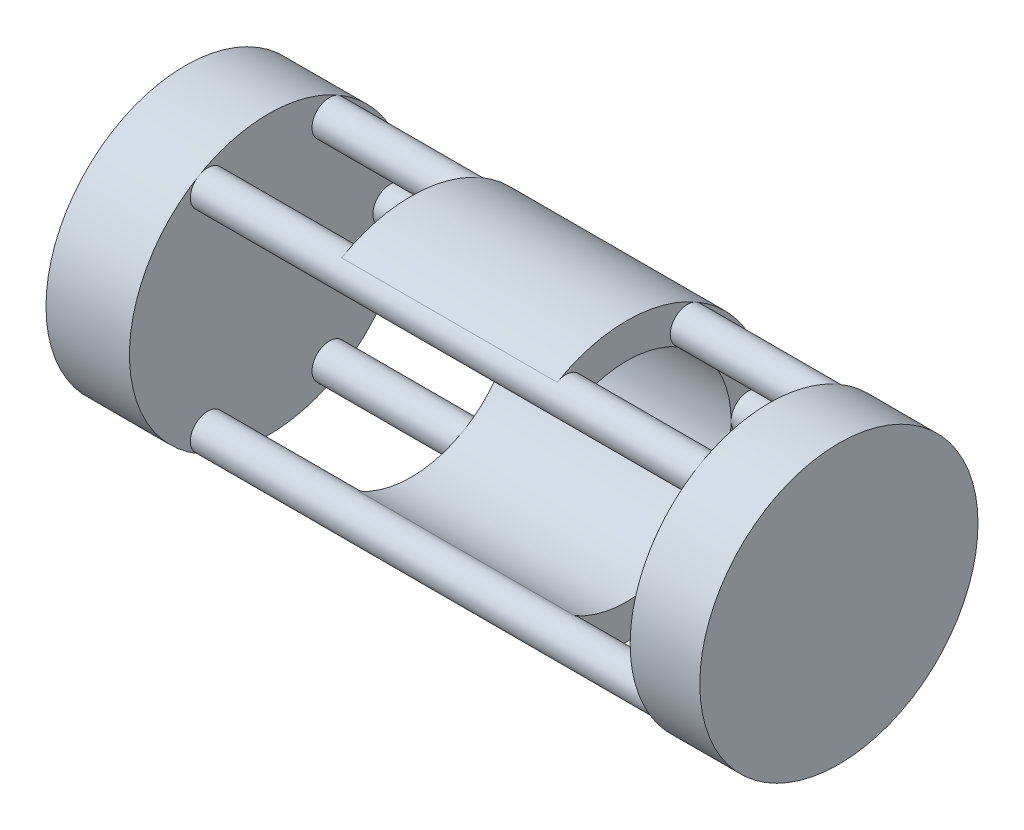
ISO-10303-21;
HEADER;
FILE_DESCRIPTION(('STEP AP214'),'2;1');
FILE_NAME('part.step','',(''),(''),'','','');
FILE_SCHEMA(('AUTOMOTIVE_DESIGN { 1 0 10303 214 1 1 1 1 }'));
ENDSEC;
DATA;
#1=APPLICATION_CONTEXT('core data for automotive mechanical design processes');
#2=APPLICATION_PROTOCOL_DEFINITION('international standard','automotive_design',2000,#1);
#3=PRODUCT_CONTEXT('',#1,'mechanical');
#4=PRODUCT('Part','Part','',(#3));
#5=PRODUCT_RELATED_PRODUCT_CATEGORY('part','',(#4));
#6=PRODUCT_DEFINITION_FORMATION('','',#4);
#7=PRODUCT_DEFINITION_CONTEXT('part definition',#1,'design');
#8=PRODUCT_DEFINITION('design','',#6,#7);
#9=PRODUCT_DEFINITION_SHAPE('','',#8);
#10=(LENGTH_UNIT() NAMED_UNIT(*) SI_UNIT(.MILLI.,.METRE.));
#11=(NAMED_UNIT(*) PLANE_ANGLE_UNIT() SI_UNIT($,.RADIAN.));
#12=(NAMED_UNIT(*) SI_UNIT($,.STERADIAN.) SOLID_ANGLE_UNIT());
#13=UNCERTAINTY_MEASURE_WITH_UNIT(LENGTH_MEASURE(1.E-05),#10,'distance_accuracy_value','');
#14=(GEOMETRIC_REPRESENTATION_CONTEXT(3) GLOBAL_UNCERTAINTY_ASSIGNED_CONTEXT((#13)) GLOBAL_UNIT_ASSIGNED_CONTEXT((#10,
#11,#12)) REPRESENTATION_CONTEXT('',''));
#15=CARTESIAN_POINT('',(0.,0.,0.));
#16=DIRECTION('',(0.,0.,1.));
#17=DIRECTION('',(1.,0.,0.));
#18=AXIS2_PLACEMENT_3D('',#15,#16,#17);
#19=CARTESIAN_POINT('',(-30.75,0.,0.));
#20=DIRECTION('',(-1.,0.,0.));
#21=DIRECTION('',(0.,0.,1.));
#22=AXIS2_PLACEMENT_3D('',#19,#20,#21);
#23=PLANE('',#22);
#24=CARTESIAN_POINT('',(-30.75,0.,0.));
#25=DIRECTION('',(-1.,0.,0.));
#26=DIRECTION('',(0.,0.,1.));
#27=AXIS2_PLACEMENT_3D('',#24,#25,#26);
#28=CIRCLE('',#27,10.);
#29=CARTESIAN_POINT('',(-30.75,0.,-10.));
#30=VERTEX_POINT('',#29);
#31=CARTESIAN_POINT('',(-30.75,-8.66025403784433,-5.0000000000001));
#32=VERTEX_POINT('',#31);
#33=EDGE_CURVE('E198',#30,#32,#28,.T.);
#34=ORIENTED_EDGE('',*,*,#33,.T.);
#35=CARTESIAN_POINT('',(-30.75,-7.57772228311379,-4.37500000000009));
#36=DIRECTION('',(-1.,0.,0.));
#37=DIRECTION('',(0.,0.866025403784433,0.50000000000001));
#38=AXIS2_PLACEMENT_3D('',#35,#36,#37);
#39=CIRCLE('',#38,1.25);
#40=CARTESIAN_POINT('',(-30.75,-6.49519052838325,-3.75000000000008));
#41=VERTEX_POINT('',#40);
#42=EDGE_CURVE('E46',#41,#32,#39,.T.);
#43=ORIENTED_EDGE('',*,*,#42,.F.);
#44=CARTESIAN_POINT('',(-30.75,0.,0.));
#45=DIRECTION('',(1.,0.,0.));
#46=DIRECTION('',(0.,0.,1.));
#47=AXIS2_PLACEMENT_3D('',#44,#45,#46);
#48=CIRCLE('',#47,7.5);
#49=CARTESIAN_POINT('',(-30.75,0.,-7.5));
#50=VERTEX_POINT('',#49);
#51=EDGE_CURVE('E200',#41,#50,#48,.T.);
#52=ORIENTED_EDGE('',*,*,#51,.T.);
#53=CARTESIAN_POINT('',(-30.75,0.,-8.75));
#54=DIRECTION('',(-1.,0.,0.));
#55=DIRECTION('',(0.,0.,1.));
#56=AXIS2_PLACEMENT_3D('',#53,#54,#55);
#57=CIRCLE('',#56,1.25);
#58=EDGE_CURVE('E40',#30,#50,#57,.T.);
#59=ORIENTED_EDGE('',*,*,#58,.F.);
#60=EDGE_LOOP('',(#34,#43,#52,#59));
#61=FACE_BOUND('',#60,.T.);
#62=ADVANCED_FACE('F32',(#61),#23,.T.);
#63=CARTESIAN_POINT('',(-30.75,6.4951905283833,-3.74999999999998));
#64=VERTEX_POINT('',#63);
#65=EDGE_CURVE('E201',#50,#64,#48,.T.);
#66=ORIENTED_EDGE('',*,*,#65,.T.);
#67=CARTESIAN_POINT('',(-30.75,7.57772228311385,-4.37499999999998));
#68=DIRECTION('',(-1.,0.,0.));
#69=DIRECTION('',(0.,-0.86602540378444,0.499999999999998));
#70=AXIS2_PLACEMENT_3D('',#67,#68,#69);
#71=CIRCLE('',#70,1.25);
#72=CARTESIAN_POINT('',(-30.75,8.6602540378444,-4.99999999999998));
#73=VERTEX_POINT('',#72);
#74=EDGE_CURVE('E52',#73,#64,#71,.T.);
#75=ORIENTED_EDGE('',*,*,#74,.F.);
#76=EDGE_CURVE('E196',#73,#30,#28,.T.);
#77=ORIENTED_EDGE('',*,*,#76,.T.);
#78=EDGE_CURVE('E183',#50,#30,#57,.T.);
#79=ORIENTED_EDGE('',*,*,#78,.F.);
#80=EDGE_LOOP('',(#66,#75,#77,#79));
#81=FACE_BOUND('',#80,.T.);
#82=ADVANCED_FACE('F231',(#81),#23,.T.);
#83=CARTESIAN_POINT('',(-30.75,6.49519052838327,3.75000000000003));
#84=VERTEX_POINT('',#83);
#85=EDGE_CURVE('E195',#64,#84,#48,.T.);
#86=ORIENTED_EDGE('',*,*,#85,.T.);
#87=CARTESIAN_POINT('',(-30.75,7.57772228311382,4.37500000000004));
#88=DIRECTION('',(-1.,0.,0.));
#89=DIRECTION('',(0.,-0.866025403784436,-0.500000000000004));
#90=AXIS2_PLACEMENT_3D('',#87,#88,#89);
#91=CIRCLE('',#90,1.25);
#92=CARTESIAN_POINT('',(-30.75,8.66025403784437,5.00000000000004));
#93=VERTEX_POINT('',#92);
#94=EDGE_CURVE('E212',#93,#84,#91,.T.);
#95=ORIENTED_EDGE('',*,*,#94,.F.);
#96=EDGE_CURVE('E160',#93,#73,#28,.T.);
#97=ORIENTED_EDGE('',*,*,#96,.T.);
#98=EDGE_CURVE('E192',#64,#73,#71,.T.);
#99=ORIENTED_EDGE('',*,*,#98,.F.);
#100=EDGE_LOOP('',(#86,#95,#97,#99));
#101=FACE_BOUND('',#100,.T.);
#102=ADVANCED_FACE('F211',(#101),#23,.T.);
#103=CARTESIAN_POINT('',(-5.,0.,0.));
#104=DIRECTION('',(1.,0.,0.));
#105=DIRECTION('',(0.,0.,-1.));
#106=AXIS2_PLACEMENT_3D('',#103,#104,#105);
#107=CYLINDRICAL_SURFACE('',#106,10.);
#108=CARTESIAN_POINT('',(-5.,0.,0.));
#109=DIRECTION('',(1.,0.,0.));
#110=DIRECTION('',(0.,0.,-1.));
#111=AXIS2_PLACEMENT_3D('',#108,#109,#110);
#112=CIRCLE('',#111,10.);
#113=CARTESIAN_POINT('',(-5.,0.,-10.));
#114=VERTEX_POINT('',#113);
#115=CARTESIAN_POINT('',(-5.,8.6602540378444,-4.99999999999998));
#116=VERTEX_POINT('',#115);
#117=EDGE_CURVE('E272',#114,#116,#112,.T.);
#118=ORIENTED_EDGE('',*,*,#117,.T.);
#119=CARTESIAN_POINT('',(-5.,8.66025403784437,5.00000000000004));
#120=VERTEX_POINT('',#119);
#121=EDGE_CURVE('E273',#116,#120,#112,.T.);
#122=ORIENTED_EDGE('',*,*,#121,.T.);
#123=CARTESIAN_POINT('',(-5.,-8.66025403784443,4.99999999999992));
#124=VERTEX_POINT('',#123);
#125=EDGE_CURVE('E282',#120,#124,#112,.T.);
#126=ORIENTED_EDGE('',*,*,#125,.T.);
#127=CARTESIAN_POINT('',(-5.,-8.66025403784433,-5.0000000000001));
#128=VERTEX_POINT('',#127);
#129=EDGE_CURVE('E278',#124,#128,#112,.T.);
#130=ORIENTED_EDGE('',*,*,#129,.T.);
#131=EDGE_CURVE('E274',#128,#114,#112,.T.);
#132=ORIENTED_EDGE('',*,*,#131,.T.);
#133=EDGE_LOOP('',(#118,#122,#126,#130,#132));
#134=FACE_BOUND('',#133,.T.);
#135=CARTESIAN_POINT('',(0.,0.,0.));
#136=DIRECTION('',(1.,0.,0.));
#137=DIRECTION('',(0.,0.,-1.));
#138=AXIS2_PLACEMENT_3D('',#135,#136,#137);
#139=CIRCLE('',#138,10.);
#140=CARTESIAN_POINT('',(0.,0.,-10.));
#141=VERTEX_POINT('',#140);
#142=EDGE_CURVE('E269',#141,#141,#139,.T.);
#143=ORIENTED_EDGE('',*,*,#142,.F.);
#144=EDGE_LOOP('',(#143));
#145=FACE_BOUND('',#144,.T.);
#146=ADVANCED_FACE('F34',(#134,#145),#107,.T.);
#147=CARTESIAN_POINT('',(-5.,0.,0.));
#148=DIRECTION('',(1.,0.,0.));
#149=DIRECTION('',(0.,0.,-1.));
#150=AXIS2_PLACEMENT_3D('',#147,#148,#149);
#151=PLANE('',#150);
#152=ORIENTED_EDGE('',*,*,#131,.F.);
#153=CARTESIAN_POINT('',(-5.,-7.57772228311379,-4.37500000000009));
#154=DIRECTION('',(-1.,0.,0.));
#155=DIRECTION('',(0.,0.866025403784433,0.50000000000001));
#156=AXIS2_PLACEMENT_3D('',#153,#154,#155);
#157=CIRCLE('',#156,1.25);
#158=EDGE_CURVE('E249',#128,#128,#157,.T.);
#159=ORIENTED_EDGE('',*,*,#158,.F.);
#160=ORIENTED_EDGE('',*,*,#129,.F.);
#161=CARTESIAN_POINT('',(-5.,-7.57772228311388,4.37499999999993));
#162=DIRECTION('',(-1.,0.,0.));
#163=DIRECTION('',(0.,0.866025403784443,-0.499999999999992));
#164=AXIS2_PLACEMENT_3D('',#161,#162,#163);
#165=CIRCLE('',#164,1.25);
#166=EDGE_CURVE('E247',#124,#124,#165,.T.);
#167=ORIENTED_EDGE('',*,*,#166,.F.);
#168=ORIENTED_EDGE('',*,*,#125,.F.);
#169=CARTESIAN_POINT('',(-5.,7.57772228311382,4.37500000000004));
#170=DIRECTION('',(-1.,0.,0.));
#171=DIRECTION('',(0.,-0.866025403784436,-0.500000000000004));
#172=AXIS2_PLACEMENT_3D('',#169,#170,#171);
#173=CIRCLE('',#172,1.25);
#174=EDGE_CURVE('E256',#120,#120,#173,.T.);
#175=ORIENTED_EDGE('',*,*,#174,.F.);
#176=ORIENTED_EDGE('',*,*,#121,.F.);
#177=CARTESIAN_POINT('',(-5.,7.57772228311385,-4.37499999999998));
#178=DIRECTION('',(-1.,0.,0.));
#179=DIRECTION('',(0.,-0.86602540378444,0.499999999999998));
#180=AXIS2_PLACEMENT_3D('',#177,#178,#179);
#181=CIRCLE('',#180,1.25);
#182=EDGE_CURVE('E261',#116,#116,#181,.T.);
#183=ORIENTED_EDGE('',*,*,#182,.F.);
#184=ORIENTED_EDGE('',*,*,#117,.F.);
#185=CARTESIAN_POINT('',(-5.,0.,-8.75));
#186=DIRECTION('',(-1.,0.,0.));
#187=DIRECTION('',(0.,0.,1.));
#188=AXIS2_PLACEMENT_3D('',#185,#186,#187);
#189=CIRCLE('',#188,1.25);
#190=EDGE_CURVE('E263',#114,#114,#189,.T.);
#191=ORIENTED_EDGE('',*,*,#190,.F.);
#192=EDGE_LOOP('',(#152,#159,#160,#167,#168,#175,#176,#183,#184,#191));
#193=FACE_BOUND('',#192,.T.);
#194=ADVANCED_FACE('F291',(#193),#151,.F.);
#195=CARTESIAN_POINT('',(0.,0.,0.));
#196=DIRECTION('',(1.,0.,0.));
#197=DIRECTION('',(0.,0.,-1.));
#198=AXIS2_PLACEMENT_3D('',#195,#196,#197);
#199=PLANE('',#198);
#200=ORIENTED_EDGE('',*,*,#142,.T.);
#201=EDGE_LOOP('',(#200));
#202=FACE_BOUND('',#201,.T.);
#203=ADVANCED_FACE('F366',(#202),#199,.T.);
#204=CARTESIAN_POINT('',(-15.25,0.,-8.75));
#205=DIRECTION('',(1.,0.,0.));
#206=DIRECTION('',(0.,0.,-1.));
#207=AXIS2_PLACEMENT_3D('',#204,#205,#206);
#208=CYLINDRICAL_SURFACE('',#207,1.25);
#209=CARTESIAN_POINT('',(-15.25,0.,-8.75));
#210=DIRECTION('',(-1.,0.,0.));
#211=DIRECTION('',(0.,0.,1.));
#212=AXIS2_PLACEMENT_3D('',#209,#210,#211);
#213=CIRCLE('',#212,1.25);
#214=CARTESIAN_POINT('',(-15.25,0.,-7.5));
#215=VERTEX_POINT('',#214);
#216=CARTESIAN_POINT('',(-15.25,0.,-10.));
#217=VERTEX_POINT('',#216);
#218=EDGE_CURVE('E266',#215,#217,#213,.T.);
#219=ORIENTED_EDGE('',*,*,#218,.F.);
#220=EDGE_CURVE('E252',#217,#215,#213,.T.);
#221=ORIENTED_EDGE('',*,*,#220,.F.);
#222=EDGE_LOOP('',(#219,#221));
#223=FACE_BOUND('',#222,.T.);
#224=ORIENTED_EDGE('',*,*,#190,.T.);
#225=EDGE_LOOP('',(#224));
#226=FACE_BOUND('',#225,.T.);
#227=ADVANCED_FACE('F362',(#223,#226),#208,.T.);
#228=CARTESIAN_POINT('',(-15.25,7.57772228311385,-4.37499999999998));
#229=DIRECTION('',(1.,0.,0.));
#230=DIRECTION('',(0.,0.,-1.));
#231=AXIS2_PLACEMENT_3D('',#228,#229,#230);
#232=CYLINDRICAL_SURFACE('',#231,1.25);
#233=CARTESIAN_POINT('',(-15.25,7.57772228311385,-4.37499999999998));
#234=DIRECTION('',(-1.,0.,0.));
#235=DIRECTION('',(0.,-0.86602540378444,0.499999999999998));
#236=AXIS2_PLACEMENT_3D('',#233,#234,#235);
#237=CIRCLE('',#236,1.25);
#238=CARTESIAN_POINT('',(-15.25,6.4951905283833,-3.74999999999998));
#239=VERTEX_POINT('',#238);
#240=CARTESIAN_POINT('',(-15.25,8.6602540378444,-4.99999999999998));
#241=VERTEX_POINT('',#240);
#242=EDGE_CURVE('E166',#239,#241,#237,.T.);
#243=ORIENTED_EDGE('',*,*,#242,.F.);
#244=EDGE_CURVE('E150',#241,#239,#237,.T.);
#245=ORIENTED_EDGE('',*,*,#244,.F.);
#246=EDGE_LOOP('',(#243,#245));
#247=FACE_BOUND('',#246,.T.);
#248=ORIENTED_EDGE('',*,*,#182,.T.);
#249=EDGE_LOOP('',(#248));
#250=FACE_BOUND('',#249,.T.);
#251=ADVANCED_FACE('F359',(#247,#250),#232,.T.);
#252=CARTESIAN_POINT('',(-15.25,7.57772228311382,4.37500000000004));
#253=DIRECTION('',(1.,0.,0.));
#254=DIRECTION('',(0.,0.,-1.));
#255=AXIS2_PLACEMENT_3D('',#252,#253,#254);
#256=CYLINDRICAL_SURFACE('',#255,1.25);
#257=CARTESIAN_POINT('',(-15.25,7.57772228311382,4.37500000000004));
#258=DIRECTION('',(-1.,0.,0.));
#259=DIRECTION('',(0.,-0.866025403784436,-0.500000000000004));
#260=AXIS2_PLACEMENT_3D('',#257,#258,#259);
#261=CIRCLE('',#260,1.25);
#262=CARTESIAN_POINT('',(-15.25,8.66025403784437,5.00000000000004));
#263=VERTEX_POINT('',#262);
#264=CARTESIAN_POINT('',(-15.25,6.49519052838327,3.75000000000003));
#265=VERTEX_POINT('',#264);
#266=EDGE_CURVE('E137',#263,#265,#261,.T.);
#267=ORIENTED_EDGE('',*,*,#266,.F.);
#268=DIRECTION('',(1.,0.,0.));
#269=VECTOR('',#268,1.);
#270=CARTESIAN_POINT('',(-30.75,8.66025403784437,5.00000000000004));
#271=LINE('',#270,#269);
#272=EDGE_CURVE('E142',#93,#263,#271,.T.);
#273=ORIENTED_EDGE('',*,*,#272,.F.);
#274=ORIENTED_EDGE('',*,*,#94,.T.);
#275=DIRECTION('',(1.,0.,0.));
#276=VECTOR('',#275,1.);
#277=CARTESIAN_POINT('',(-30.75,6.49519052838327,3.75000000000003));
#278=LINE('',#277,#276);
#279=EDGE_CURVE('E145',#84,#265,#278,.T.);
#280=ORIENTED_EDGE('',*,*,#279,.T.);
#281=EDGE_LOOP('',(#267,#273,#274,#280));
#282=FACE_BOUND('',#281,.T.);
#283=ORIENTED_EDGE('',*,*,#174,.T.);
#284=EDGE_LOOP('',(#283));
#285=FACE_BOUND('',#284,.T.);
#286=CARTESIAN_POINT('',(-41.,7.57772228311382,4.37500000000004));
#287=DIRECTION('',(-1.,0.,0.));
#288=DIRECTION('',(0.,-0.866025403784436,-0.500000000000004));
#289=AXIS2_PLACEMENT_3D('',#286,#287,#288);
#290=CIRCLE('',#289,1.25);
#291=CARTESIAN_POINT('',(-41.,8.66025403784437,5.00000000000004));
#292=VERTEX_POINT('',#291);
#293=EDGE_CURVE('E219',#292,#292,#290,.T.);
#294=ORIENTED_EDGE('',*,*,#293,.F.);
#295=EDGE_LOOP('',(#294));
#296=FACE_BOUND('',#295,.T.);
#297=ADVANCED_FACE('F139',(#282,#285,#296),#256,.T.);
#298=CARTESIAN_POINT('',(-15.25,-7.57772228311388,4.37499999999993));
#299=DIRECTION('',(1.,0.,0.));
#300=DIRECTION('',(0.,0.,-1.));
#301=AXIS2_PLACEMENT_3D('',#298,#299,#300);
#302=CYLINDRICAL_SURFACE('',#301,1.25);
#303=CARTESIAN_POINT('',(-15.25,-7.57772228311388,4.37499999999993));
#304=DIRECTION('',(-1.,0.,0.));
#305=DIRECTION('',(0.,0.866025403784443,-0.499999999999992));
#306=AXIS2_PLACEMENT_3D('',#303,#304,#305);
#307=CIRCLE('',#306,1.25);
#308=CARTESIAN_POINT('',(-15.25,-6.49519052838333,3.74999999999994));
#309=VERTEX_POINT('',#308);
#310=CARTESIAN_POINT('',(-15.25,-8.66025403784443,4.99999999999992));
#311=VERTEX_POINT('',#310);
#312=EDGE_CURVE('E253',#309,#311,#307,.T.);
#313=ORIENTED_EDGE('',*,*,#312,.F.);
#314=DIRECTION('',(1.,0.,0.));
#315=VECTOR('',#314,1.);
#316=CARTESIAN_POINT('',(-30.75,-6.49519052838333,3.74999999999994));
#317=LINE('',#316,#315);
#318=CARTESIAN_POINT('',(-30.75,-6.49519052838333,3.74999999999994));
#319=VERTEX_POINT('',#318);
#320=EDGE_CURVE('E217',#319,#309,#317,.T.);
#321=ORIENTED_EDGE('',*,*,#320,.F.);
#322=CARTESIAN_POINT('',(-30.75,-7.57772228311388,4.37499999999993));
#323=DIRECTION('',(-1.,0.,0.));
#324=DIRECTION('',(0.,0.866025403784443,-0.499999999999992));
#325=AXIS2_PLACEMENT_3D('',#322,#323,#324);
#326=CIRCLE('',#325,1.25);
#327=CARTESIAN_POINT('',(-30.75,-8.66025403784443,4.99999999999992));
#328=VERTEX_POINT('',#327);
#329=EDGE_CURVE('E225',#319,#328,#326,.T.);
#330=ORIENTED_EDGE('',*,*,#329,.T.);
#331=DIRECTION('',(1.,0.,0.));
#332=VECTOR('',#331,1.);
#333=CARTESIAN_POINT('',(-30.75,-8.66025403784444,4.99999999999992));
#334=LINE('',#333,#332);
#335=EDGE_CURVE('E151',#328,#311,#334,.T.);
#336=ORIENTED_EDGE('',*,*,#335,.T.);
#337=EDGE_LOOP('',(#313,#321,#330,#336));
#338=FACE_BOUND('',#337,.T.);
#339=ORIENTED_EDGE('',*,*,#166,.T.);
#340=EDGE_LOOP('',(#339));
#341=FACE_BOUND('',#340,.T.);
#342=CARTESIAN_POINT('',(-41.,-7.57772228311388,4.37499999999993));
#343=DIRECTION('',(-1.,0.,0.));
#344=DIRECTION('',(0.,0.866025403784443,-0.499999999999992));
#345=AXIS2_PLACEMENT_3D('',#342,#343,#344);
#346=CIRCLE('',#345,1.25);
#347=CARTESIAN_POINT('',(-41.,-8.66025403784443,4.99999999999992));
#348=VERTEX_POINT('',#347);
#349=EDGE_CURVE('E220',#348,#348,#346,.T.);
#350=ORIENTED_EDGE('',*,*,#349,.F.);
#351=EDGE_LOOP('',(#350));
#352=FACE_BOUND('',#351,.T.);
#353=ADVANCED_FACE('F294',(#338,#341,#352),#302,.T.);
#354=CARTESIAN_POINT('',(-15.25,-7.57772228311379,-4.37500000000009));
#355=DIRECTION('',(1.,0.,0.));
#356=DIRECTION('',(0.,0.,-1.));
#357=AXIS2_PLACEMENT_3D('',#354,#355,#356);
#358=CYLINDRICAL_SURFACE('',#357,1.25);
#359=CARTESIAN_POINT('',(-15.25,-7.57772228311379,-4.37500000000009));
#360=DIRECTION('',(-1.,0.,0.));
#361=DIRECTION('',(0.,0.866025403784433,0.50000000000001));
#362=AXIS2_PLACEMENT_3D('',#359,#360,#361);
#363=CIRCLE('',#362,1.25);
#364=CARTESIAN_POINT('',(-15.25,-6.49519052838325,-3.75000000000008));
#365=VERTEX_POINT('',#364);
#366=CARTESIAN_POINT('',(-15.25,-8.66025403784433,-5.0000000000001));
#367=VERTEX_POINT('',#366);
#368=EDGE_CURVE('E244',#365,#367,#363,.T.);
#369=ORIENTED_EDGE('',*,*,#368,.F.);
#370=EDGE_CURVE('E248',#367,#365,#363,.T.);
#371=ORIENTED_EDGE('',*,*,#370,.F.);
#372=EDGE_LOOP('',(#369,#371));
#373=FACE_BOUND('',#372,.T.);
#374=ORIENTED_EDGE('',*,*,#158,.T.);
#375=EDGE_LOOP('',(#374));
#376=FACE_BOUND('',#375,.T.);
#377=ADVANCED_FACE('F297',(#373,#376),#358,.T.);
#378=CARTESIAN_POINT('',(-15.25,0.,0.));
#379=DIRECTION('',(-1.,0.,0.));
#380=DIRECTION('',(0.,0.,1.));
#381=AXIS2_PLACEMENT_3D('',#378,#379,#380);
#382=PLANE('',#381);
#383=CARTESIAN_POINT('',(-15.25,0.,0.));
#384=DIRECTION('',(1.,0.,0.));
#385=DIRECTION('',(0.,0.,1.));
#386=AXIS2_PLACEMENT_3D('',#383,#384,#385);
#387=CIRCLE('',#386,7.5);
#388=EDGE_CURVE('E172',#215,#239,#387,.T.);
#389=ORIENTED_EDGE('',*,*,#388,.F.);
#390=ORIENTED_EDGE('',*,*,#218,.T.);
#391=CARTESIAN_POINT('',(-15.25,0.,0.));
#392=DIRECTION('',(-1.,0.,0.));
#393=DIRECTION('',(0.,0.,1.));
#394=AXIS2_PLACEMENT_3D('',#391,#392,#393);
#395=CIRCLE('',#394,10.);
#396=EDGE_CURVE('E169',#241,#217,#395,.T.);
#397=ORIENTED_EDGE('',*,*,#396,.F.);
#398=ORIENTED_EDGE('',*,*,#244,.T.);
#399=EDGE_LOOP('',(#389,#390,#397,#398));
#400=FACE_BOUND('',#399,.T.);
#401=ADVANCED_FACE('F344',(#400),#382,.F.);
#402=EDGE_CURVE('E175',#217,#367,#395,.T.);
#403=ORIENTED_EDGE('',*,*,#402,.F.);
#404=ORIENTED_EDGE('',*,*,#220,.T.);
#405=EDGE_CURVE('E237',#365,#215,#387,.T.);
#406=ORIENTED_EDGE('',*,*,#405,.F.);
#407=ORIENTED_EDGE('',*,*,#368,.T.);
#408=EDGE_LOOP('',(#403,#404,#406,#407));
#409=FACE_BOUND('',#408,.T.);
#410=ADVANCED_FACE('F347',(#409),#382,.F.);
#411=EDGE_CURVE('E168',#239,#265,#387,.T.);
#412=ORIENTED_EDGE('',*,*,#411,.F.);
#413=ORIENTED_EDGE('',*,*,#242,.T.);
#414=EDGE_CURVE('E157',#263,#241,#395,.T.);
#415=ORIENTED_EDGE('',*,*,#414,.F.);
#416=ORIENTED_EDGE('',*,*,#266,.T.);
#417=EDGE_LOOP('',(#412,#413,#415,#416));
#418=FACE_BOUND('',#417,.T.);
#419=ADVANCED_FACE('F165',(#418),#382,.F.);
#420=EDGE_CURVE('E174',#309,#365,#387,.T.);
#421=ORIENTED_EDGE('',*,*,#420,.F.);
#422=ORIENTED_EDGE('',*,*,#312,.T.);
#423=EDGE_CURVE('E171',#367,#311,#395,.T.);
#424=ORIENTED_EDGE('',*,*,#423,.F.);
#425=ORIENTED_EDGE('',*,*,#370,.T.);
#426=EDGE_LOOP('',(#421,#422,#424,#425));
#427=FACE_BOUND('',#426,.T.);
#428=ADVANCED_FACE('F349',(#427),#382,.F.);
#429=CARTESIAN_POINT('',(-30.75,0.,0.));
#430=DIRECTION('',(1.,0.,0.));
#431=DIRECTION('',(0.,0.,-1.));
#432=AXIS2_PLACEMENT_3D('',#429,#430,#431);
#433=CYLINDRICAL_SURFACE('',#432,10.);
#434=ORIENTED_EDGE('',*,*,#414,.T.);
#435=ORIENTED_EDGE('',*,*,#396,.T.);
#436=ORIENTED_EDGE('',*,*,#402,.T.);
#437=ORIENTED_EDGE('',*,*,#423,.T.);
#438=ORIENTED_EDGE('',*,*,#335,.F.);
#439=EDGE_CURVE('E197',#32,#328,#28,.T.);
#440=ORIENTED_EDGE('',*,*,#439,.F.);
#441=ORIENTED_EDGE('',*,*,#33,.F.);
#442=ORIENTED_EDGE('',*,*,#76,.F.);
#443=ORIENTED_EDGE('',*,*,#96,.F.);
#444=ORIENTED_EDGE('',*,*,#272,.T.);
#445=EDGE_LOOP('',(#434,#435,#436,#437,#438,#440,#441,#442,#443,#444));
#446=FACE_BOUND('',#445,.T.);
#447=ADVANCED_FACE('F155',(#446),#433,.T.);
#448=CARTESIAN_POINT('',(-30.75,0.,0.));
#449=DIRECTION('',(1.,0.,0.));
#450=DIRECTION('',(0.,0.,-1.));
#451=AXIS2_PLACEMENT_3D('',#448,#449,#450);
#452=CYLINDRICAL_SURFACE('',#451,7.5);
#453=ORIENTED_EDGE('',*,*,#420,.T.);
#454=ORIENTED_EDGE('',*,*,#405,.T.);
#455=ORIENTED_EDGE('',*,*,#388,.T.);
#456=ORIENTED_EDGE('',*,*,#411,.T.);
#457=ORIENTED_EDGE('',*,*,#279,.F.);
#458=ORIENTED_EDGE('',*,*,#85,.F.);
#459=ORIENTED_EDGE('',*,*,#65,.F.);
#460=ORIENTED_EDGE('',*,*,#51,.F.);
#461=EDGE_CURVE('E162',#319,#41,#48,.T.);
#462=ORIENTED_EDGE('',*,*,#461,.F.);
#463=ORIENTED_EDGE('',*,*,#320,.T.);
#464=EDGE_LOOP('',(#453,#454,#455,#456,#457,#458,#459,#460,#462,#463));
#465=FACE_BOUND('',#464,.T.);
#466=ADVANCED_FACE('F215',(#465),#452,.F.);
#467=ORIENTED_EDGE('',*,*,#461,.T.);
#468=CARTESIAN_POINT('',(-30.75,-7.57772228311379,-4.37500000000009));
#469=DIRECTION('',(-1.,0.,0.));
#470=DIRECTION('',(0.,0.,1.));
#471=AXIS2_PLACEMENT_3D('',#468,#469,#470);
#472=CIRCLE('',#471,1.25);
#473=EDGE_CURVE('E11',#41,#32,#472,.F.);
#474=ORIENTED_EDGE('',*,*,#473,.T.);
#475=ORIENTED_EDGE('',*,*,#439,.T.);
#476=ORIENTED_EDGE('',*,*,#329,.F.);
#477=EDGE_LOOP('',(#467,#474,#475,#476));
#478=FACE_BOUND('',#477,.T.);
#479=ADVANCED_FACE('F328',(#478),#23,.T.);
#480=CARTESIAN_POINT('',(-41.,0.,-8.75));
#481=DIRECTION('',(1.,0.,0.));
#482=DIRECTION('',(0.,0.,-1.));
#483=AXIS2_PLACEMENT_3D('',#480,#481,#482);
#484=CYLINDRICAL_SURFACE('',#483,1.25);
#485=CARTESIAN_POINT('',(-41.,0.,-8.75));
#486=DIRECTION('',(-1.,0.,0.));
#487=DIRECTION('',(0.,0.,1.));
#488=AXIS2_PLACEMENT_3D('',#485,#486,#487);
#489=CIRCLE('',#488,1.25);
#490=CARTESIAN_POINT('',(-41.,0.,-10.));
#491=VERTEX_POINT('',#490);
#492=EDGE_CURVE('E178',#491,#491,#489,.T.);
#493=ORIENTED_EDGE('',*,*,#492,.F.);
#494=EDGE_LOOP('',(#493));
#495=FACE_BOUND('',#494,.T.);
#496=ORIENTED_EDGE('',*,*,#78,.T.);
#497=ORIENTED_EDGE('',*,*,#58,.T.);
#498=EDGE_LOOP('',(#496,#497));
#499=FACE_BOUND('',#498,.T.);
#500=ADVANCED_FACE('F326',(#495,#499),#484,.T.);
#501=CARTESIAN_POINT('',(-41.,7.57772228311385,-4.37499999999998));
#502=DIRECTION('',(1.,0.,0.));
#503=DIRECTION('',(0.,0.,-1.));
#504=AXIS2_PLACEMENT_3D('',#501,#502,#503);
#505=CYLINDRICAL_SURFACE('',#504,1.25);
#506=CARTESIAN_POINT('',(-41.,7.57772228311385,-4.37499999999998));
#507=DIRECTION('',(-1.,0.,0.));
#508=DIRECTION('',(0.,-0.86602540378444,0.499999999999998));
#509=AXIS2_PLACEMENT_3D('',#506,#507,#508);
#510=CIRCLE('',#509,1.25);
#511=CARTESIAN_POINT('',(-41.,8.6602540378444,-4.99999999999998));
#512=VERTEX_POINT('',#511);
#513=EDGE_CURVE('E189',#512,#512,#510,.T.);
#514=ORIENTED_EDGE('',*,*,#513,.F.);
#515=EDGE_LOOP('',(#514));
#516=FACE_BOUND('',#515,.T.);
#517=ORIENTED_EDGE('',*,*,#98,.T.);
#518=ORIENTED_EDGE('',*,*,#74,.T.);
#519=EDGE_LOOP('',(#517,#518));
#520=FACE_BOUND('',#519,.T.);
#521=ADVANCED_FACE('F230',(#516,#520),#505,.T.);
#522=CARTESIAN_POINT('',(-41.,-7.57772228311379,-4.37500000000009));
#523=DIRECTION('',(1.,0.,0.));
#524=DIRECTION('',(0.,0.,-1.));
#525=AXIS2_PLACEMENT_3D('',#522,#523,#524);
#526=CYLINDRICAL_SURFACE('',#525,1.25);
#527=CARTESIAN_POINT('',(-41.,-7.57772228311379,-4.37500000000009));
#528=DIRECTION('',(-1.,0.,0.));
#529=DIRECTION('',(0.,0.866025403784433,0.50000000000001));
#530=AXIS2_PLACEMENT_3D('',#527,#528,#529);
#531=CIRCLE('',#530,1.25);
#532=CARTESIAN_POINT('',(-41.,-8.66025403784433,-5.0000000000001));
#533=VERTEX_POINT('',#532);
#534=EDGE_CURVE('E320',#533,#533,#531,.T.);
#535=ORIENTED_EDGE('',*,*,#534,.F.);
#536=EDGE_LOOP('',(#535));
#537=FACE_BOUND('',#536,.T.);
#538=ORIENTED_EDGE('',*,*,#42,.T.);
#539=ORIENTED_EDGE('',*,*,#473,.F.);
#540=EDGE_LOOP('',(#538,#539));
#541=FACE_BOUND('',#540,.T.);
#542=ADVANCED_FACE('F335',(#537,#541),#526,.T.);
#543=CARTESIAN_POINT('',(-47.,0.,0.));
#544=DIRECTION('',(1.,0.,0.));
#545=DIRECTION('',(0.,0.,-1.));
#546=AXIS2_PLACEMENT_3D('',#543,#544,#545);
#547=CYLINDRICAL_SURFACE('',#546,10.);
#548=CARTESIAN_POINT('',(-47.,0.,0.));
#549=DIRECTION('',(-1.,0.,0.));
#550=DIRECTION('',(0.,0.,1.));
#551=AXIS2_PLACEMENT_3D('',#548,#549,#550);
#552=CIRCLE('',#551,10.);
#553=CARTESIAN_POINT('',(-47.,0.,10.));
#554=VERTEX_POINT('',#553);
#555=EDGE_CURVE('E319',#554,#554,#552,.T.);
#556=ORIENTED_EDGE('',*,*,#555,.F.);
#557=EDGE_LOOP('',(#556));
#558=FACE_BOUND('',#557,.T.);
#559=CARTESIAN_POINT('',(-41.,0.,0.));
#560=DIRECTION('',(-1.,0.,0.));
#561=DIRECTION('',(0.,0.,1.));
#562=AXIS2_PLACEMENT_3D('',#559,#560,#561);
#563=CIRCLE('',#562,10.);
#564=EDGE_CURVE('E312',#292,#512,#563,.T.);
#565=ORIENTED_EDGE('',*,*,#564,.T.);
#566=EDGE_CURVE('E316',#512,#491,#563,.T.);
#567=ORIENTED_EDGE('',*,*,#566,.T.);
#568=EDGE_CURVE('E315',#491,#533,#563,.T.);
#569=ORIENTED_EDGE('',*,*,#568,.T.);
#570=EDGE_CURVE('E305',#533,#348,#563,.T.);
#571=ORIENTED_EDGE('',*,*,#570,.T.);
#572=EDGE_CURVE('E308',#348,#292,#563,.T.);
#573=ORIENTED_EDGE('',*,*,#572,.T.);
#574=EDGE_LOOP('',(#565,#567,#569,#571,#573));
#575=FACE_BOUND('',#574,.T.);
#576=ADVANCED_FACE('F313',(#558,#575),#547,.T.);
#577=CARTESIAN_POINT('',(-47.,0.,0.));
#578=DIRECTION('',(-1.,0.,0.));
#579=DIRECTION('',(0.,0.,1.));
#580=AXIS2_PLACEMENT_3D('',#577,#578,#579);
#581=PLANE('',#580);
#582=ORIENTED_EDGE('',*,*,#555,.T.);
#583=EDGE_LOOP('',(#582));
#584=FACE_BOUND('',#583,.T.);
#585=ADVANCED_FACE('F485',(#584),#581,.T.);
#586=CARTESIAN_POINT('',(-41.,0.,0.));
#587=DIRECTION('',(-1.,0.,0.));
#588=DIRECTION('',(0.,0.,1.));
#589=AXIS2_PLACEMENT_3D('',#586,#587,#588);
#590=PLANE('',#589);
#591=ORIENTED_EDGE('',*,*,#568,.F.);
#592=ORIENTED_EDGE('',*,*,#492,.T.);
#593=ORIENTED_EDGE('',*,*,#566,.F.);
#594=ORIENTED_EDGE('',*,*,#513,.T.);
#595=ORIENTED_EDGE('',*,*,#564,.F.);
#596=ORIENTED_EDGE('',*,*,#293,.T.);
#597=ORIENTED_EDGE('',*,*,#572,.F.);
#598=ORIENTED_EDGE('',*,*,#349,.T.);
#599=ORIENTED_EDGE('',*,*,#570,.F.);
#600=ORIENTED_EDGE('',*,*,#534,.T.);
#601=EDGE_LOOP('',(#591,#592,#593,#594,#595,#596,#597,#598,#599,#600));
#602=FACE_BOUND('',#601,.T.);
#603=ADVANCED_FACE('F302',(#602),#590,.F.);
#604=CLOSED_SHELL('',(#62,#82,#102,#146,#194,#203,#227,#251,#297,#353,#377,#401,#410,#419,#428,
#447,#466,#479,#500,#521,#542,#576,#585,#603));
#605=MANIFOLD_SOLID_BREP('B2',#604);
#606=ADVANCED_BREP_SHAPE_REPRESENTATION('',(#18,#605),#14);
#607=SHAPE_DEFINITION_REPRESENTATION(#9,#606);
ENDSEC;
END-ISO-10303-21;
